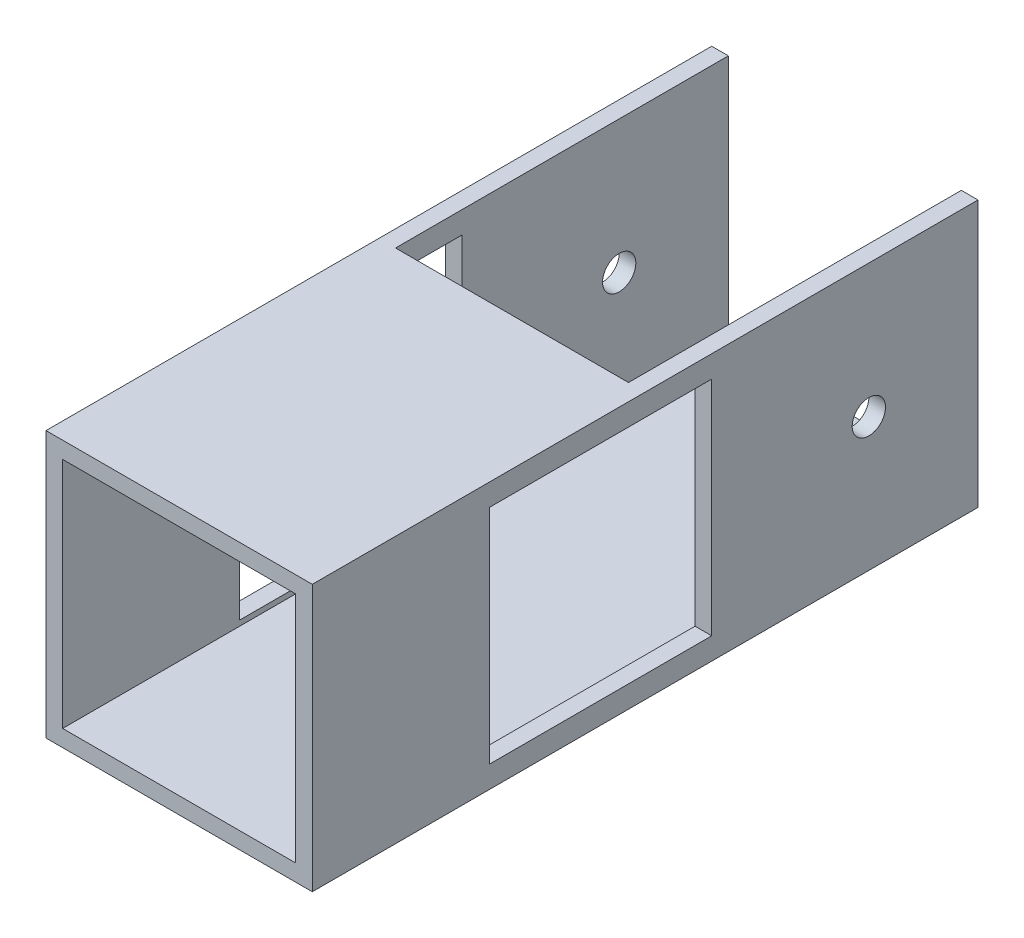
ISO-10303-21;
HEADER;
FILE_DESCRIPTION(('STEP AP214'),'2;1');
FILE_NAME('part.step','',(''),(''),'','','');
FILE_SCHEMA(('AUTOMOTIVE_DESIGN { 1 0 10303 214 1 1 1 1 }'));
ENDSEC;
DATA;
#1=APPLICATION_CONTEXT('core data for automotive mechanical design processes');
#2=APPLICATION_PROTOCOL_DEFINITION('international standard','automotive_design',2000,#1);
#3=PRODUCT_CONTEXT('',#1,'mechanical');
#4=PRODUCT('Part','Part','',(#3));
#5=PRODUCT_RELATED_PRODUCT_CATEGORY('part','',(#4));
#6=PRODUCT_DEFINITION_FORMATION('','',#4);
#7=PRODUCT_DEFINITION_CONTEXT('part definition',#1,'design');
#8=PRODUCT_DEFINITION('design','',#6,#7);
#9=PRODUCT_DEFINITION_SHAPE('','',#8);
#10=(LENGTH_UNIT() NAMED_UNIT(*) SI_UNIT(.MILLI.,.METRE.));
#11=(NAMED_UNIT(*) PLANE_ANGLE_UNIT() SI_UNIT($,.RADIAN.));
#12=(NAMED_UNIT(*) SI_UNIT($,.STERADIAN.) SOLID_ANGLE_UNIT());
#13=UNCERTAINTY_MEASURE_WITH_UNIT(LENGTH_MEASURE(1.E-05),#10,'distance_accuracy_value','');
#14=(GEOMETRIC_REPRESENTATION_CONTEXT(3) GLOBAL_UNCERTAINTY_ASSIGNED_CONTEXT((#13)) GLOBAL_UNIT_ASSIGNED_CONTEXT((#10,
#11,#12)) REPRESENTATION_CONTEXT('',''));
#15=CARTESIAN_POINT('',(0.,0.,0.));
#16=DIRECTION('',(0.,0.,1.));
#17=DIRECTION('',(1.,0.,0.));
#18=AXIS2_PLACEMENT_3D('',#15,#16,#17);
#19=CARTESIAN_POINT('',(0.,0.,127.));
#20=DIRECTION('',(0.,0.,1.));
#21=DIRECTION('',(1.,0.,0.));
#22=AXIS2_PLACEMENT_3D('',#19,#20,#21);
#23=PLANE('',#22);
#24=DIRECTION('',(0.,1.,0.));
#25=VECTOR('',#24,1.);
#26=CARTESIAN_POINT('',(25.4,25.4,127.));
#27=LINE('',#26,#25);
#28=CARTESIAN_POINT('',(25.4,-25.4,127.));
#29=VERTEX_POINT('',#28);
#30=CARTESIAN_POINT('',(25.4,25.4,127.));
#31=VERTEX_POINT('',#30);
#32=EDGE_CURVE('E267',#29,#31,#27,.T.);
#33=ORIENTED_EDGE('',*,*,#32,.T.);
#34=DIRECTION('',(-1.,0.,0.));
#35=VECTOR('',#34,1.);
#36=CARTESIAN_POINT('',(-25.4,25.4,127.));
#37=LINE('',#36,#35);
#38=CARTESIAN_POINT('',(-25.4,25.4,127.));
#39=VERTEX_POINT('',#38);
#40=EDGE_CURVE('E270',#31,#39,#37,.T.);
#41=ORIENTED_EDGE('',*,*,#40,.T.);
#42=DIRECTION('',(0.,-1.,0.));
#43=VECTOR('',#42,1.);
#44=CARTESIAN_POINT('',(-25.4,25.4,127.));
#45=LINE('',#44,#43);
#46=CARTESIAN_POINT('',(-25.4,-25.4,127.));
#47=VERTEX_POINT('',#46);
#48=EDGE_CURVE('E273',#39,#47,#45,.T.);
#49=ORIENTED_EDGE('',*,*,#48,.T.);
#50=DIRECTION('',(1.,0.,0.));
#51=VECTOR('',#50,1.);
#52=CARTESIAN_POINT('',(-25.4,-25.4,127.));
#53=LINE('',#52,#51);
#54=EDGE_CURVE('E275',#47,#29,#53,.T.);
#55=ORIENTED_EDGE('',*,*,#54,.T.);
#56=EDGE_LOOP('',(#33,#41,#49,#55));
#57=FACE_BOUND('',#56,.T.);
#58=DIRECTION('',(-1.,0.,0.));
#59=VECTOR('',#58,1.);
#60=CARTESIAN_POINT('',(-22.225,22.225,127.));
#61=LINE('',#60,#59);
#62=CARTESIAN_POINT('',(22.225,22.225,127.));
#63=VERTEX_POINT('',#62);
#64=CARTESIAN_POINT('',(-22.225,22.225,127.));
#65=VERTEX_POINT('',#64);
#66=EDGE_CURVE('E241',#63,#65,#61,.T.);
#67=ORIENTED_EDGE('',*,*,#66,.F.);
#68=DIRECTION('',(0.,1.,0.));
#69=VECTOR('',#68,1.);
#70=CARTESIAN_POINT('',(22.225,22.225,127.));
#71=LINE('',#70,#69);
#72=CARTESIAN_POINT('',(22.225,-22.225,127.));
#73=VERTEX_POINT('',#72);
#74=EDGE_CURVE('E239',#73,#63,#71,.T.);
#75=ORIENTED_EDGE('',*,*,#74,.F.);
#76=DIRECTION('',(1.,0.,0.));
#77=VECTOR('',#76,1.);
#78=CARTESIAN_POINT('',(-22.225,-22.225,127.));
#79=LINE('',#78,#77);
#80=CARTESIAN_POINT('',(-22.225,-22.225,127.));
#81=VERTEX_POINT('',#80);
#82=EDGE_CURVE('E247',#81,#73,#79,.T.);
#83=ORIENTED_EDGE('',*,*,#82,.F.);
#84=DIRECTION('',(0.,-1.,0.));
#85=VECTOR('',#84,1.);
#86=CARTESIAN_POINT('',(-22.225,22.225,127.));
#87=LINE('',#86,#85);
#88=EDGE_CURVE('E244',#65,#81,#87,.T.);
#89=ORIENTED_EDGE('',*,*,#88,.F.);
#90=EDGE_LOOP('',(#67,#75,#83,#89));
#91=FACE_BOUND('',#90,.T.);
#92=ADVANCED_FACE('F33',(#57,#91),#23,.T.);
#93=CARTESIAN_POINT('',(0.,0.,0.));
#94=DIRECTION('',(0.,0.,1.));
#95=DIRECTION('',(1.,0.,0.));
#96=AXIS2_PLACEMENT_3D('',#93,#94,#95);
#97=PLANE('',#96);
#98=DIRECTION('',(-1.,0.,0.));
#99=VECTOR('',#98,1.);
#100=CARTESIAN_POINT('',(-25.4,25.4,0.));
#101=LINE('',#100,#99);
#102=CARTESIAN_POINT('',(-22.225,25.4,0.));
#103=VERTEX_POINT('',#102);
#104=CARTESIAN_POINT('',(-25.4,25.4,0.));
#105=VERTEX_POINT('',#104);
#106=EDGE_CURVE('E280',#103,#105,#101,.T.);
#107=ORIENTED_EDGE('',*,*,#106,.F.);
#108=DIRECTION('',(0.,-1.,0.));
#109=VECTOR('',#108,1.);
#110=CARTESIAN_POINT('',(-22.225,22.225,0.));
#111=LINE('',#110,#109);
#112=CARTESIAN_POINT('',(-22.225,-22.225,0.));
#113=VERTEX_POINT('',#112);
#114=EDGE_CURVE('E251',#103,#113,#111,.T.);
#115=ORIENTED_EDGE('',*,*,#114,.T.);
#116=DIRECTION('',(1.,0.,0.));
#117=VECTOR('',#116,1.);
#118=CARTESIAN_POINT('',(-22.225,-22.225,0.));
#119=LINE('',#118,#117);
#120=CARTESIAN_POINT('',(22.225,-22.225,0.));
#121=VERTEX_POINT('',#120);
#122=EDGE_CURVE('E242',#113,#121,#119,.T.);
#123=ORIENTED_EDGE('',*,*,#122,.T.);
#124=DIRECTION('',(0.,1.,0.));
#125=VECTOR('',#124,1.);
#126=CARTESIAN_POINT('',(22.225,22.225,0.));
#127=LINE('',#126,#125);
#128=CARTESIAN_POINT('',(22.225,25.4,0.));
#129=VERTEX_POINT('',#128);
#130=EDGE_CURVE('E238',#121,#129,#127,.T.);
#131=ORIENTED_EDGE('',*,*,#130,.T.);
#132=CARTESIAN_POINT('',(25.4,25.4,0.));
#133=VERTEX_POINT('',#132);
#134=EDGE_CURVE('E281',#133,#129,#101,.T.);
#135=ORIENTED_EDGE('',*,*,#134,.F.);
#136=DIRECTION('',(0.,1.,0.));
#137=VECTOR('',#136,1.);
#138=CARTESIAN_POINT('',(25.4,25.4,0.));
#139=LINE('',#138,#137);
#140=CARTESIAN_POINT('',(25.4,-25.4,0.));
#141=VERTEX_POINT('',#140);
#142=EDGE_CURVE('E266',#141,#133,#139,.T.);
#143=ORIENTED_EDGE('',*,*,#142,.F.);
#144=DIRECTION('',(1.,0.,0.));
#145=VECTOR('',#144,1.);
#146=CARTESIAN_POINT('',(-25.4,-25.4,0.));
#147=LINE('',#146,#145);
#148=CARTESIAN_POINT('',(-25.4,-25.4,0.));
#149=VERTEX_POINT('',#148);
#150=EDGE_CURVE('E271',#149,#141,#147,.T.);
#151=ORIENTED_EDGE('',*,*,#150,.F.);
#152=DIRECTION('',(0.,-1.,0.));
#153=VECTOR('',#152,1.);
#154=CARTESIAN_POINT('',(-25.4,25.4,0.));
#155=LINE('',#154,#153);
#156=EDGE_CURVE('E284',#105,#149,#155,.T.);
#157=ORIENTED_EDGE('',*,*,#156,.F.);
#158=EDGE_LOOP('',(#107,#115,#123,#131,#135,#143,#151,#157));
#159=FACE_BOUND('',#158,.T.);
#160=ADVANCED_FACE('F324',(#159),#97,.F.);
#161=CARTESIAN_POINT('',(25.4,25.4,127.));
#162=DIRECTION('',(-1.,0.,0.));
#163=DIRECTION('',(0.,-1.,0.));
#164=AXIS2_PLACEMENT_3D('',#161,#162,#163);
#165=PLANE('',#164);
#166=DIRECTION('',(0.,0.,-1.));
#167=VECTOR('',#166,1.);
#168=CARTESIAN_POINT('',(25.4,21.209,127.));
#169=LINE('',#168,#167);
#170=CARTESIAN_POINT('',(25.4,21.209,93.218));
#171=VERTEX_POINT('',#170);
#172=CARTESIAN_POINT('',(25.4,21.209,50.8));
#173=VERTEX_POINT('',#172);
#174=EDGE_CURVE('E204',#171,#173,#169,.T.);
#175=ORIENTED_EDGE('',*,*,#174,.T.);
#176=DIRECTION('',(0.,-1.,0.));
#177=VECTOR('',#176,1.);
#178=CARTESIAN_POINT('',(25.4,25.4,50.8));
#179=LINE('',#178,#177);
#180=CARTESIAN_POINT('',(25.4,-21.209,50.8));
#181=VERTEX_POINT('',#180);
#182=EDGE_CURVE('E210',#173,#181,#179,.T.);
#183=ORIENTED_EDGE('',*,*,#182,.T.);
#184=DIRECTION('',(0.,0.,1.));
#185=VECTOR('',#184,1.);
#186=CARTESIAN_POINT('',(25.4,-21.209,127.));
#187=LINE('',#186,#185);
#188=CARTESIAN_POINT('',(25.4,-21.209,93.218));
#189=VERTEX_POINT('',#188);
#190=EDGE_CURVE('E194',#181,#189,#187,.T.);
#191=ORIENTED_EDGE('',*,*,#190,.T.);
#192=DIRECTION('',(0.,1.,0.));
#193=VECTOR('',#192,1.);
#194=CARTESIAN_POINT('',(25.4,25.4,93.218));
#195=LINE('',#194,#193);
#196=EDGE_CURVE('E199',#189,#171,#195,.T.);
#197=ORIENTED_EDGE('',*,*,#196,.T.);
#198=EDGE_LOOP('',(#175,#183,#191,#197));
#199=FACE_BOUND('',#198,.T.);
#200=CARTESIAN_POINT('',(25.4,0.,20.828));
#201=DIRECTION('',(-1.,0.,0.));
#202=DIRECTION('',(0.,-1.,0.));
#203=AXIS2_PLACEMENT_3D('',#200,#201,#202);
#204=CIRCLE('',#203,3.175);
#205=CARTESIAN_POINT('',(25.4,-3.175,20.828));
#206=VERTEX_POINT('',#205);
#207=EDGE_CURVE('E220',#206,#206,#204,.T.);
#208=ORIENTED_EDGE('',*,*,#207,.T.);
#209=EDGE_LOOP('',(#208));
#210=FACE_BOUND('',#209,.T.);
#211=ORIENTED_EDGE('',*,*,#142,.T.);
#212=DIRECTION('',(0.,0.,-1.));
#213=VECTOR('',#212,1.);
#214=CARTESIAN_POINT('',(25.4,25.4,127.));
#215=LINE('',#214,#213);
#216=EDGE_CURVE('E295',#31,#133,#215,.T.);
#217=ORIENTED_EDGE('',*,*,#216,.F.);
#218=ORIENTED_EDGE('',*,*,#32,.F.);
#219=DIRECTION('',(0.,0.,-1.));
#220=VECTOR('',#219,1.);
#221=CARTESIAN_POINT('',(25.4,-25.4,127.));
#222=LINE('',#221,#220);
#223=EDGE_CURVE('E277',#29,#141,#222,.T.);
#224=ORIENTED_EDGE('',*,*,#223,.T.);
#225=EDGE_LOOP('',(#211,#217,#218,#224));
#226=FACE_BOUND('',#225,.T.);
#227=ADVANCED_FACE('F35',(#199,#210,#226),#165,.F.);
#228=CARTESIAN_POINT('',(-25.4,25.4,127.));
#229=DIRECTION('',(0.,-1.,0.));
#230=DIRECTION('',(0.,0.,-1.));
#231=AXIS2_PLACEMENT_3D('',#228,#229,#230);
#232=PLANE('',#231);
#233=DIRECTION('',(1.,0.,0.));
#234=VECTOR('',#233,1.);
#235=CARTESIAN_POINT('',(-22.225,25.4,63.5));
#236=LINE('',#235,#234);
#237=CARTESIAN_POINT('',(-22.225,25.4,63.5));
#238=VERTEX_POINT('',#237);
#239=CARTESIAN_POINT('',(22.225,25.4,63.5));
#240=VERTEX_POINT('',#239);
#241=EDGE_CURVE('E226',#238,#240,#236,.T.);
#242=ORIENTED_EDGE('',*,*,#241,.F.);
#243=DIRECTION('',(0.,0.,1.));
#244=VECTOR('',#243,1.);
#245=CARTESIAN_POINT('',(-22.225,25.4,0.));
#246=LINE('',#245,#244);
#247=EDGE_CURVE('E223',#103,#238,#246,.T.);
#248=ORIENTED_EDGE('',*,*,#247,.F.);
#249=ORIENTED_EDGE('',*,*,#106,.T.);
#250=DIRECTION('',(0.,0.,-1.));
#251=VECTOR('',#250,1.);
#252=CARTESIAN_POINT('',(-25.4,25.4,127.));
#253=LINE('',#252,#251);
#254=EDGE_CURVE('E292',#39,#105,#253,.T.);
#255=ORIENTED_EDGE('',*,*,#254,.F.);
#256=ORIENTED_EDGE('',*,*,#40,.F.);
#257=ORIENTED_EDGE('',*,*,#216,.T.);
#258=ORIENTED_EDGE('',*,*,#134,.T.);
#259=DIRECTION('',(0.,0.,-1.));
#260=VECTOR('',#259,1.);
#261=CARTESIAN_POINT('',(22.225,25.4,0.));
#262=LINE('',#261,#260);
#263=EDGE_CURVE('E229',#240,#129,#262,.T.);
#264=ORIENTED_EDGE('',*,*,#263,.F.);
#265=EDGE_LOOP('',(#242,#248,#249,#255,#256,#257,#258,#264));
#266=FACE_BOUND('',#265,.T.);
#267=ADVANCED_FACE('F342',(#266),#232,.F.);
#268=CARTESIAN_POINT('',(-25.4,25.4,127.));
#269=DIRECTION('',(1.,0.,0.));
#270=DIRECTION('',(0.,1.,0.));
#271=AXIS2_PLACEMENT_3D('',#268,#269,#270);
#272=PLANE('',#271);
#273=DIRECTION('',(0.,0.,1.));
#274=VECTOR('',#273,1.);
#275=CARTESIAN_POINT('',(-25.4,-21.209,93.218));
#276=LINE('',#275,#274);
#277=CARTESIAN_POINT('',(-25.4,-21.209,50.8));
#278=VERTEX_POINT('',#277);
#279=CARTESIAN_POINT('',(-25.4,-21.209,93.218));
#280=VERTEX_POINT('',#279);
#281=EDGE_CURVE('E172',#278,#280,#276,.T.);
#282=ORIENTED_EDGE('',*,*,#281,.F.);
#283=DIRECTION('',(0.,-1.,0.));
#284=VECTOR('',#283,1.);
#285=CARTESIAN_POINT('',(-25.4,-21.209,50.8));
#286=LINE('',#285,#284);
#287=CARTESIAN_POINT('',(-25.4,21.209,50.8));
#288=VERTEX_POINT('',#287);
#289=EDGE_CURVE('E56',#288,#278,#286,.T.);
#290=ORIENTED_EDGE('',*,*,#289,.F.);
#291=DIRECTION('',(0.,0.,-1.));
#292=VECTOR('',#291,1.);
#293=CARTESIAN_POINT('',(-25.4,21.209,93.218));
#294=LINE('',#293,#292);
#295=CARTESIAN_POINT('',(-25.4,21.209,93.218));
#296=VERTEX_POINT('',#295);
#297=EDGE_CURVE('E180',#296,#288,#294,.T.);
#298=ORIENTED_EDGE('',*,*,#297,.F.);
#299=DIRECTION('',(0.,1.,0.));
#300=VECTOR('',#299,1.);
#301=CARTESIAN_POINT('',(-25.4,-21.209,93.218));
#302=LINE('',#301,#300);
#303=EDGE_CURVE('E163',#280,#296,#302,.T.);
#304=ORIENTED_EDGE('',*,*,#303,.F.);
#305=EDGE_LOOP('',(#282,#290,#298,#304));
#306=FACE_BOUND('',#305,.T.);
#307=CARTESIAN_POINT('',(-25.4,0.,20.828));
#308=DIRECTION('',(-1.,0.,0.));
#309=DIRECTION('',(0.,-1.,0.));
#310=AXIS2_PLACEMENT_3D('',#307,#308,#309);
#311=CIRCLE('',#310,3.175);
#312=CARTESIAN_POINT('',(-25.4,-3.175,20.828));
#313=VERTEX_POINT('',#312);
#314=EDGE_CURVE('E213',#313,#313,#311,.T.);
#315=ORIENTED_EDGE('',*,*,#314,.F.);
#316=EDGE_LOOP('',(#315));
#317=FACE_BOUND('',#316,.T.);
#318=ORIENTED_EDGE('',*,*,#156,.T.);
#319=DIRECTION('',(0.,0.,-1.));
#320=VECTOR('',#319,1.);
#321=CARTESIAN_POINT('',(-25.4,-25.4,127.));
#322=LINE('',#321,#320);
#323=EDGE_CURVE('E289',#47,#149,#322,.T.);
#324=ORIENTED_EDGE('',*,*,#323,.F.);
#325=ORIENTED_EDGE('',*,*,#48,.F.);
#326=ORIENTED_EDGE('',*,*,#254,.T.);
#327=EDGE_LOOP('',(#318,#324,#325,#326));
#328=FACE_BOUND('',#327,.T.);
#329=ADVANCED_FACE('F177',(#306,#317,#328),#272,.F.);
#330=CARTESIAN_POINT('',(-25.4,-25.4,127.));
#331=DIRECTION('',(0.,1.,0.));
#332=DIRECTION('',(0.,0.,1.));
#333=AXIS2_PLACEMENT_3D('',#330,#331,#332);
#334=PLANE('',#333);
#335=ORIENTED_EDGE('',*,*,#150,.T.);
#336=ORIENTED_EDGE('',*,*,#223,.F.);
#337=ORIENTED_EDGE('',*,*,#54,.F.);
#338=ORIENTED_EDGE('',*,*,#323,.T.);
#339=EDGE_LOOP('',(#335,#336,#337,#338));
#340=FACE_BOUND('',#339,.T.);
#341=ADVANCED_FACE('F337',(#340),#334,.F.);
#342=CARTESIAN_POINT('',(22.225,22.225,127.));
#343=DIRECTION('',(-1.,0.,0.));
#344=DIRECTION('',(0.,-1.,0.));
#345=AXIS2_PLACEMENT_3D('',#342,#343,#344);
#346=PLANE('',#345);
#347=DIRECTION('',(0.,-1.,0.));
#348=VECTOR('',#347,1.);
#349=CARTESIAN_POINT('',(22.225,22.225,50.8));
#350=LINE('',#349,#348);
#351=CARTESIAN_POINT('',(22.225,21.209,50.8));
#352=VERTEX_POINT('',#351);
#353=CARTESIAN_POINT('',(22.225,-21.209,50.8));
#354=VERTEX_POINT('',#353);
#355=EDGE_CURVE('E207',#352,#354,#350,.T.);
#356=ORIENTED_EDGE('',*,*,#355,.F.);
#357=DIRECTION('',(0.,0.,-1.));
#358=VECTOR('',#357,1.);
#359=CARTESIAN_POINT('',(22.225,21.209,127.));
#360=LINE('',#359,#358);
#361=CARTESIAN_POINT('',(22.225,21.209,93.218));
#362=VERTEX_POINT('',#361);
#363=EDGE_CURVE('E202',#362,#352,#360,.T.);
#364=ORIENTED_EDGE('',*,*,#363,.F.);
#365=DIRECTION('',(0.,1.,0.));
#366=VECTOR('',#365,1.);
#367=CARTESIAN_POINT('',(22.225,22.225,93.218));
#368=LINE('',#367,#366);
#369=CARTESIAN_POINT('',(22.225,-21.209,93.218));
#370=VERTEX_POINT('',#369);
#371=EDGE_CURVE('E197',#370,#362,#368,.T.);
#372=ORIENTED_EDGE('',*,*,#371,.F.);
#373=DIRECTION('',(0.,0.,1.));
#374=VECTOR('',#373,1.);
#375=CARTESIAN_POINT('',(22.225,-21.209,127.));
#376=LINE('',#375,#374);
#377=EDGE_CURVE('E192',#354,#370,#376,.T.);
#378=ORIENTED_EDGE('',*,*,#377,.F.);
#379=EDGE_LOOP('',(#356,#364,#372,#378));
#380=FACE_BOUND('',#379,.T.);
#381=CARTESIAN_POINT('',(22.225,0.,20.828));
#382=DIRECTION('',(-1.,0.,0.));
#383=DIRECTION('',(0.,-1.,0.));
#384=AXIS2_PLACEMENT_3D('',#381,#382,#383);
#385=CIRCLE('',#384,3.175);
#386=CARTESIAN_POINT('',(22.225,-3.175,20.828));
#387=VERTEX_POINT('',#386);
#388=EDGE_CURVE('E217',#387,#387,#385,.T.);
#389=ORIENTED_EDGE('',*,*,#388,.F.);
#390=EDGE_LOOP('',(#389));
#391=FACE_BOUND('',#390,.T.);
#392=DIRECTION('',(0.,0.,-1.));
#393=VECTOR('',#392,1.);
#394=CARTESIAN_POINT('',(22.225,22.225,127.));
#395=LINE('',#394,#393);
#396=CARTESIAN_POINT('',(22.225,22.225,63.5));
#397=VERTEX_POINT('',#396);
#398=EDGE_CURVE('E263',#63,#397,#395,.T.);
#399=ORIENTED_EDGE('',*,*,#398,.T.);
#400=DIRECTION('',(0.,1.,0.));
#401=VECTOR('',#400,1.);
#402=CARTESIAN_POINT('',(22.225,2.0319999999999,63.5));
#403=LINE('',#402,#401);
#404=EDGE_CURVE('E233',#397,#240,#403,.T.);
#405=ORIENTED_EDGE('',*,*,#404,.T.);
#406=ORIENTED_EDGE('',*,*,#263,.T.);
#407=ORIENTED_EDGE('',*,*,#130,.F.);
#408=DIRECTION('',(0.,0.,-1.));
#409=VECTOR('',#408,1.);
#410=CARTESIAN_POINT('',(22.225,-22.225,127.));
#411=LINE('',#410,#409);
#412=EDGE_CURVE('E249',#73,#121,#411,.T.);
#413=ORIENTED_EDGE('',*,*,#412,.F.);
#414=ORIENTED_EDGE('',*,*,#74,.T.);
#415=EDGE_LOOP('',(#399,#405,#406,#407,#413,#414));
#416=FACE_BOUND('',#415,.T.);
#417=ADVANCED_FACE('F334',(#380,#391,#416),#346,.T.);
#418=CARTESIAN_POINT('',(-22.225,22.225,127.));
#419=DIRECTION('',(0.,-1.,0.));
#420=DIRECTION('',(0.,0.,-1.));
#421=AXIS2_PLACEMENT_3D('',#418,#419,#420);
#422=PLANE('',#421);
#423=DIRECTION('',(-1.,0.,0.));
#424=VECTOR('',#423,1.);
#425=CARTESIAN_POINT('',(-22.225,22.225,63.5));
#426=LINE('',#425,#424);
#427=CARTESIAN_POINT('',(-22.225,22.225,63.5));
#428=VERTEX_POINT('',#427);
#429=EDGE_CURVE('E235',#397,#428,#426,.T.);
#430=ORIENTED_EDGE('',*,*,#429,.F.);
#431=ORIENTED_EDGE('',*,*,#398,.F.);
#432=ORIENTED_EDGE('',*,*,#66,.T.);
#433=DIRECTION('',(0.,0.,-1.));
#434=VECTOR('',#433,1.);
#435=CARTESIAN_POINT('',(-22.225,22.225,127.));
#436=LINE('',#435,#434);
#437=EDGE_CURVE('E260',#65,#428,#436,.T.);
#438=ORIENTED_EDGE('',*,*,#437,.T.);
#439=EDGE_LOOP('',(#430,#431,#432,#438));
#440=FACE_BOUND('',#439,.T.);
#441=ADVANCED_FACE('F378',(#440),#422,.T.);
#442=CARTESIAN_POINT('',(-22.225,22.225,127.));
#443=DIRECTION('',(1.,0.,0.));
#444=DIRECTION('',(0.,1.,0.));
#445=AXIS2_PLACEMENT_3D('',#442,#443,#444);
#446=PLANE('',#445);
#447=DIRECTION('',(0.,1.,0.));
#448=VECTOR('',#447,1.);
#449=CARTESIAN_POINT('',(-22.225,22.225,50.8));
#450=LINE('',#449,#448);
#451=CARTESIAN_POINT('',(-22.225,-21.209,50.8));
#452=VERTEX_POINT('',#451);
#453=CARTESIAN_POINT('',(-22.225,21.209,50.8));
#454=VERTEX_POINT('',#453);
#455=EDGE_CURVE('E11',#452,#454,#450,.T.);
#456=ORIENTED_EDGE('',*,*,#455,.F.);
#457=DIRECTION('',(0.,0.,-1.));
#458=VECTOR('',#457,1.);
#459=CARTESIAN_POINT('',(-22.225,-21.209,127.));
#460=LINE('',#459,#458);
#461=CARTESIAN_POINT('',(-22.225,-21.209,93.218));
#462=VERTEX_POINT('',#461);
#463=EDGE_CURVE('E298',#462,#452,#460,.T.);
#464=ORIENTED_EDGE('',*,*,#463,.F.);
#465=DIRECTION('',(0.,-1.,0.));
#466=VECTOR('',#465,1.);
#467=CARTESIAN_POINT('',(-22.225,22.225,93.218));
#468=LINE('',#467,#466);
#469=CARTESIAN_POINT('',(-22.225,21.209,93.218));
#470=VERTEX_POINT('',#469);
#471=EDGE_CURVE('E166',#470,#462,#468,.T.);
#472=ORIENTED_EDGE('',*,*,#471,.F.);
#473=DIRECTION('',(0.,0.,1.));
#474=VECTOR('',#473,1.);
#475=CARTESIAN_POINT('',(-22.225,21.209,127.));
#476=LINE('',#475,#474);
#477=EDGE_CURVE('E41',#454,#470,#476,.T.);
#478=ORIENTED_EDGE('',*,*,#477,.F.);
#479=EDGE_LOOP('',(#456,#464,#472,#478));
#480=FACE_BOUND('',#479,.T.);
#481=CARTESIAN_POINT('',(-22.225,0.,20.828));
#482=DIRECTION('',(1.,0.,0.));
#483=DIRECTION('',(0.,1.,0.));
#484=AXIS2_PLACEMENT_3D('',#481,#482,#483);
#485=CIRCLE('',#484,3.175);
#486=CARTESIAN_POINT('',(-22.225,3.175,20.828));
#487=VERTEX_POINT('',#486);
#488=EDGE_CURVE('E216',#487,#487,#485,.T.);
#489=ORIENTED_EDGE('',*,*,#488,.F.);
#490=EDGE_LOOP('',(#489));
#491=FACE_BOUND('',#490,.T.);
#492=ORIENTED_EDGE('',*,*,#114,.F.);
#493=ORIENTED_EDGE('',*,*,#247,.T.);
#494=DIRECTION('',(0.,1.,0.));
#495=VECTOR('',#494,1.);
#496=CARTESIAN_POINT('',(-22.225,2.0319999999999,63.5));
#497=LINE('',#496,#495);
#498=EDGE_CURVE('E232',#428,#238,#497,.T.);
#499=ORIENTED_EDGE('',*,*,#498,.F.);
#500=ORIENTED_EDGE('',*,*,#437,.F.);
#501=ORIENTED_EDGE('',*,*,#88,.T.);
#502=DIRECTION('',(0.,0.,-1.));
#503=VECTOR('',#502,1.);
#504=CARTESIAN_POINT('',(-22.225,-22.225,127.));
#505=LINE('',#504,#503);
#506=EDGE_CURVE('E257',#81,#113,#505,.T.);
#507=ORIENTED_EDGE('',*,*,#506,.T.);
#508=EDGE_LOOP('',(#492,#493,#499,#500,#501,#507));
#509=FACE_BOUND('',#508,.T.);
#510=ADVANCED_FACE('F308',(#480,#491,#509),#446,.T.);
#511=CARTESIAN_POINT('',(-22.225,-22.225,127.));
#512=DIRECTION('',(0.,1.,0.));
#513=DIRECTION('',(0.,0.,1.));
#514=AXIS2_PLACEMENT_3D('',#511,#512,#513);
#515=PLANE('',#514);
#516=ORIENTED_EDGE('',*,*,#122,.F.);
#517=ORIENTED_EDGE('',*,*,#506,.F.);
#518=ORIENTED_EDGE('',*,*,#82,.T.);
#519=ORIENTED_EDGE('',*,*,#412,.T.);
#520=EDGE_LOOP('',(#516,#517,#518,#519));
#521=FACE_BOUND('',#520,.T.);
#522=ADVANCED_FACE('F382',(#521),#515,.T.);
#523=CARTESIAN_POINT('',(-22.225,2.0319999999999,63.5));
#524=DIRECTION('',(0.,0.,1.));
#525=DIRECTION('',(1.,0.,0.));
#526=AXIS2_PLACEMENT_3D('',#523,#524,#525);
#527=PLANE('',#526);
#528=ORIENTED_EDGE('',*,*,#429,.T.);
#529=ORIENTED_EDGE('',*,*,#498,.T.);
#530=ORIENTED_EDGE('',*,*,#241,.T.);
#531=ORIENTED_EDGE('',*,*,#404,.F.);
#532=EDGE_LOOP('',(#528,#529,#530,#531));
#533=FACE_BOUND('',#532,.T.);
#534=ADVANCED_FACE('F354',(#533),#527,.F.);
#535=CARTESIAN_POINT('',(74.7307595228387,0.,20.828));
#536=DIRECTION('',(-1.,0.,0.));
#537=DIRECTION('',(0.,-1.,0.));
#538=AXIS2_PLACEMENT_3D('',#535,#536,#537);
#539=CYLINDRICAL_SURFACE('',#538,3.175);
#540=ORIENTED_EDGE('',*,*,#488,.T.);
#541=EDGE_LOOP('',(#540));
#542=FACE_BOUND('',#541,.T.);
#543=ORIENTED_EDGE('',*,*,#314,.T.);
#544=EDGE_LOOP('',(#543));
#545=FACE_BOUND('',#544,.T.);
#546=ADVANCED_FACE('F389',(#542,#545),#539,.F.);
#547=ORIENTED_EDGE('',*,*,#388,.T.);
#548=EDGE_LOOP('',(#547));
#549=FACE_BOUND('',#548,.T.);
#550=ORIENTED_EDGE('',*,*,#207,.F.);
#551=EDGE_LOOP('',(#550));
#552=FACE_BOUND('',#551,.T.);
#553=ADVANCED_FACE('F405',(#549,#552),#539,.F.);
#554=CARTESIAN_POINT('',(74.7307595228387,-21.209,93.218));
#555=DIRECTION('',(0.,-1.,0.));
#556=DIRECTION('',(0.,0.,-1.));
#557=AXIS2_PLACEMENT_3D('',#554,#555,#556);
#558=PLANE('',#557);
#559=ORIENTED_EDGE('',*,*,#463,.T.);
#560=DIRECTION('',(-1.,0.,0.));
#561=VECTOR('',#560,1.);
#562=CARTESIAN_POINT('',(74.7307595228387,-21.209,50.8));
#563=LINE('',#562,#561);
#564=EDGE_CURVE('E174',#452,#278,#563,.T.);
#565=ORIENTED_EDGE('',*,*,#564,.T.);
#566=ORIENTED_EDGE('',*,*,#281,.T.);
#567=DIRECTION('',(-1.,0.,0.));
#568=VECTOR('',#567,1.);
#569=CARTESIAN_POINT('',(74.7307595228387,-21.209,93.218));
#570=LINE('',#569,#568);
#571=EDGE_CURVE('E158',#462,#280,#570,.T.);
#572=ORIENTED_EDGE('',*,*,#571,.F.);
#573=EDGE_LOOP('',(#559,#565,#566,#572));
#574=FACE_BOUND('',#573,.T.);
#575=ADVANCED_FACE('F173',(#574),#558,.F.);
#576=CARTESIAN_POINT('',(74.7307595228387,-21.209,93.218));
#577=DIRECTION('',(0.,0.,1.));
#578=DIRECTION('',(1.,0.,0.));
#579=AXIS2_PLACEMENT_3D('',#576,#577,#578);
#580=PLANE('',#579);
#581=ORIENTED_EDGE('',*,*,#471,.T.);
#582=ORIENTED_EDGE('',*,*,#571,.T.);
#583=ORIENTED_EDGE('',*,*,#303,.T.);
#584=DIRECTION('',(-1.,0.,0.));
#585=VECTOR('',#584,1.);
#586=CARTESIAN_POINT('',(74.7307595228387,21.209,93.218));
#587=LINE('',#586,#585);
#588=EDGE_CURVE('E189',#470,#296,#587,.T.);
#589=ORIENTED_EDGE('',*,*,#588,.F.);
#590=EDGE_LOOP('',(#581,#582,#583,#589));
#591=FACE_BOUND('',#590,.T.);
#592=ADVANCED_FACE('F160',(#591),#580,.F.);
#593=CARTESIAN_POINT('',(74.7307595228387,21.209,93.218));
#594=DIRECTION('',(0.,1.,0.));
#595=DIRECTION('',(0.,0.,1.));
#596=AXIS2_PLACEMENT_3D('',#593,#594,#595);
#597=PLANE('',#596);
#598=ORIENTED_EDGE('',*,*,#477,.T.);
#599=ORIENTED_EDGE('',*,*,#588,.T.);
#600=ORIENTED_EDGE('',*,*,#297,.T.);
#601=DIRECTION('',(-1.,0.,0.));
#602=VECTOR('',#601,1.);
#603=CARTESIAN_POINT('',(74.7307595228387,21.209,50.8));
#604=LINE('',#603,#602);
#605=EDGE_CURVE('E185',#454,#288,#604,.T.);
#606=ORIENTED_EDGE('',*,*,#605,.F.);
#607=EDGE_LOOP('',(#598,#599,#600,#606));
#608=FACE_BOUND('',#607,.T.);
#609=ADVANCED_FACE('F305',(#608),#597,.F.);
#610=CARTESIAN_POINT('',(74.7307595228387,-21.209,50.8));
#611=DIRECTION('',(0.,0.,-1.));
#612=DIRECTION('',(-1.,0.,0.));
#613=AXIS2_PLACEMENT_3D('',#610,#611,#612);
#614=PLANE('',#613);
#615=ORIENTED_EDGE('',*,*,#455,.T.);
#616=ORIENTED_EDGE('',*,*,#605,.T.);
#617=ORIENTED_EDGE('',*,*,#289,.T.);
#618=ORIENTED_EDGE('',*,*,#564,.F.);
#619=EDGE_LOOP('',(#615,#616,#617,#618));
#620=FACE_BOUND('',#619,.T.);
#621=ADVANCED_FACE('F310',(#620),#614,.F.);
#622=EDGE_CURVE('E187',#173,#352,#604,.T.);
#623=ORIENTED_EDGE('',*,*,#622,.T.);
#624=ORIENTED_EDGE('',*,*,#355,.T.);
#625=EDGE_CURVE('E169',#181,#354,#563,.T.);
#626=ORIENTED_EDGE('',*,*,#625,.F.);
#627=ORIENTED_EDGE('',*,*,#182,.F.);
#628=EDGE_LOOP('',(#623,#624,#626,#627));
#629=FACE_BOUND('',#628,.T.);
#630=ADVANCED_FACE('F312',(#629),#614,.F.);
#631=EDGE_CURVE('E188',#171,#362,#587,.T.);
#632=ORIENTED_EDGE('',*,*,#631,.T.);
#633=ORIENTED_EDGE('',*,*,#363,.T.);
#634=ORIENTED_EDGE('',*,*,#622,.F.);
#635=ORIENTED_EDGE('',*,*,#174,.F.);
#636=EDGE_LOOP('',(#632,#633,#634,#635));
#637=FACE_BOUND('',#636,.T.);
#638=ADVANCED_FACE('F318',(#637),#597,.F.);
#639=EDGE_CURVE('E48',#189,#370,#570,.T.);
#640=ORIENTED_EDGE('',*,*,#639,.T.);
#641=ORIENTED_EDGE('',*,*,#371,.T.);
#642=ORIENTED_EDGE('',*,*,#631,.F.);
#643=ORIENTED_EDGE('',*,*,#196,.F.);
#644=EDGE_LOOP('',(#640,#641,#642,#643));
#645=FACE_BOUND('',#644,.T.);
#646=ADVANCED_FACE('F503',(#645),#580,.F.);
#647=ORIENTED_EDGE('',*,*,#625,.T.);
#648=ORIENTED_EDGE('',*,*,#377,.T.);
#649=ORIENTED_EDGE('',*,*,#639,.F.);
#650=ORIENTED_EDGE('',*,*,#190,.F.);
#651=EDGE_LOOP('',(#647,#648,#649,#650));
#652=FACE_BOUND('',#651,.T.);
#653=ADVANCED_FACE('F414',(#652),#558,.F.);
#654=CLOSED_SHELL('',(#92,#160,#227,#267,#329,#341,#417,#441,#510,#522,#534,#546,#553,#575,#592,
#609,#621,#630,#638,#646,#653));
#655=MANIFOLD_SOLID_BREP('B2',#654);
#656=ADVANCED_BREP_SHAPE_REPRESENTATION('',(#18,#655),#14);
#657=SHAPE_DEFINITION_REPRESENTATION(#9,#656);
ENDSEC;
END-ISO-10303-21;
